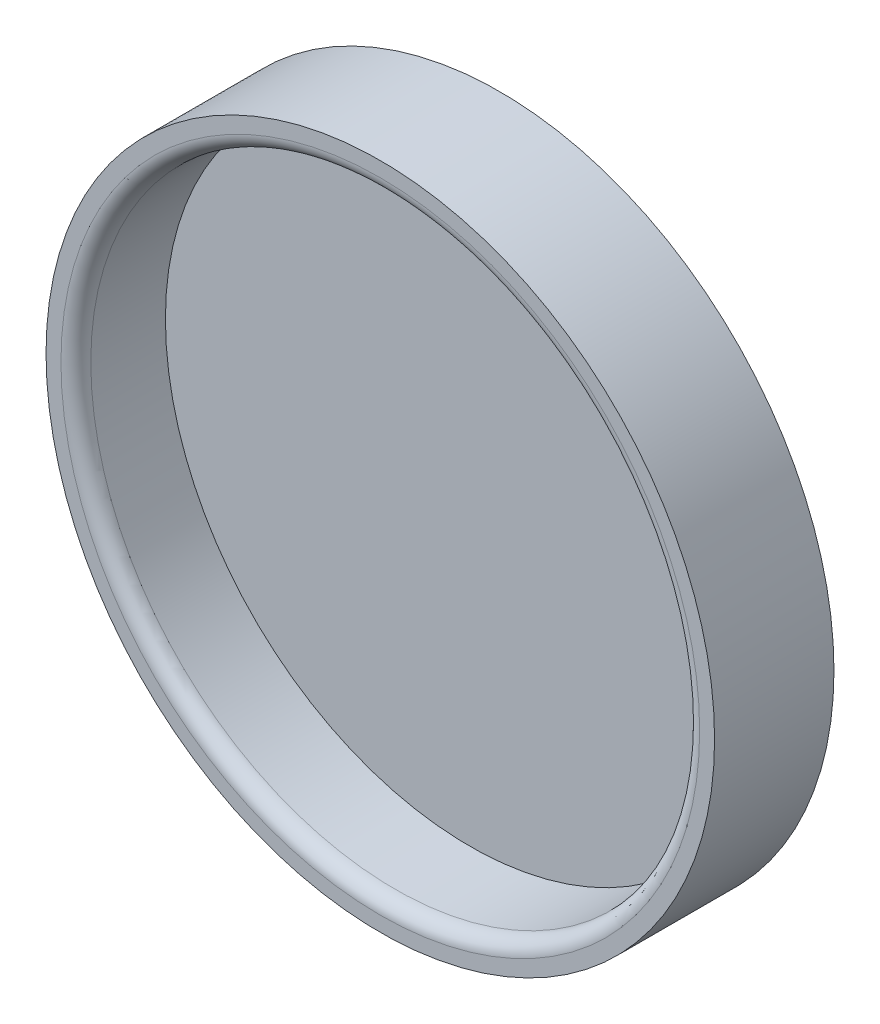
ISO-10303-21;
HEADER;
FILE_DESCRIPTION(('STEP AP214'),'2;1');
FILE_NAME('part.step','',(''),(''),'','','');
FILE_SCHEMA(('AUTOMOTIVE_DESIGN { 1 0 10303 214 1 1 1 1 }'));
ENDSEC;
DATA;
#1=APPLICATION_CONTEXT('core data for automotive mechanical design processes');
#2=APPLICATION_PROTOCOL_DEFINITION('international standard','automotive_design',2000,#1);
#3=PRODUCT_CONTEXT('',#1,'mechanical');
#4=PRODUCT('Part','Part','',(#3));
#5=PRODUCT_RELATED_PRODUCT_CATEGORY('part','',(#4));
#6=PRODUCT_DEFINITION_FORMATION('','',#4);
#7=PRODUCT_DEFINITION_CONTEXT('part definition',#1,'design');
#8=PRODUCT_DEFINITION('design','',#6,#7);
#9=PRODUCT_DEFINITION_SHAPE('','',#8);
#10=(LENGTH_UNIT() NAMED_UNIT(*) SI_UNIT(.MILLI.,.METRE.));
#11=(NAMED_UNIT(*) PLANE_ANGLE_UNIT() SI_UNIT($,.RADIAN.));
#12=(NAMED_UNIT(*) SI_UNIT($,.STERADIAN.) SOLID_ANGLE_UNIT());
#13=UNCERTAINTY_MEASURE_WITH_UNIT(LENGTH_MEASURE(1.E-05),#10,'distance_accuracy_value','');
#14=(GEOMETRIC_REPRESENTATION_CONTEXT(3) GLOBAL_UNCERTAINTY_ASSIGNED_CONTEXT((#13)) GLOBAL_UNIT_ASSIGNED_CONTEXT((#10,
#11,#12)) REPRESENTATION_CONTEXT('',''));
#15=CARTESIAN_POINT('',(0.,0.,0.));
#16=DIRECTION('',(0.,0.,1.));
#17=DIRECTION('',(1.,0.,0.));
#18=AXIS2_PLACEMENT_3D('',#15,#16,#17);
#19=CARTESIAN_POINT('',(0.,0.,1.));
#20=DIRECTION('',(0.,0.,-1.));
#21=DIRECTION('',(-1.,0.,0.));
#22=AXIS2_PLACEMENT_3D('',#19,#20,#21);
#23=CYLINDRICAL_SURFACE('',#22,11.2);
#24=CARTESIAN_POINT('',(0.,0.,0.));
#25=DIRECTION('',(0.,0.,1.));
#26=DIRECTION('',(1.,0.,0.));
#27=AXIS2_PLACEMENT_3D('',#24,#25,#26);
#28=CIRCLE('',#27,11.2);
#29=CARTESIAN_POINT('',(11.2,0.,0.));
#30=VERTEX_POINT('',#29);
#31=EDGE_CURVE('E56',#30,#30,#28,.T.);
#32=ORIENTED_EDGE('',*,*,#31,.T.);
#33=EDGE_LOOP('',(#32));
#34=FACE_BOUND('',#33,.T.);
#35=CARTESIAN_POINT('',(0.,0.,4.));
#36=DIRECTION('',(0.,0.,1.));
#37=DIRECTION('',(1.,0.,0.));
#38=AXIS2_PLACEMENT_3D('',#35,#36,#37);
#39=CIRCLE('',#38,11.2);
#40=CARTESIAN_POINT('',(11.2,0.,4.));
#41=VERTEX_POINT('',#40);
#42=EDGE_CURVE('E61',#41,#41,#39,.T.);
#43=ORIENTED_EDGE('',*,*,#42,.F.);
#44=EDGE_LOOP('',(#43));
#45=FACE_BOUND('',#44,.T.);
#46=ADVANCED_FACE('F41',(#34,#45),#23,.T.);
#47=CARTESIAN_POINT('',(0.,0.,0.));
#48=DIRECTION('',(0.,0.,1.));
#49=DIRECTION('',(1.,0.,0.));
#50=AXIS2_PLACEMENT_3D('',#47,#48,#49);
#51=PLANE('',#50);
#52=ORIENTED_EDGE('',*,*,#31,.F.);
#53=EDGE_LOOP('',(#52));
#54=FACE_BOUND('',#53,.T.);
#55=ADVANCED_FACE('F68',(#54),#51,.F.);
#56=CARTESIAN_POINT('',(0.,0.,4.));
#57=DIRECTION('',(0.,0.,1.));
#58=DIRECTION('',(1.,0.,0.));
#59=AXIS2_PLACEMENT_3D('',#56,#57,#58);
#60=PLANE('',#59);
#61=CARTESIAN_POINT('',(0.,0.,4.));
#62=DIRECTION('',(0.,0.,1.));
#63=DIRECTION('',(1.,0.,0.));
#64=AXIS2_PLACEMENT_3D('',#61,#62,#63);
#65=CIRCLE('',#64,10.7);
#66=CARTESIAN_POINT('',(10.7,0.,4.));
#67=VERTEX_POINT('',#66);
#68=EDGE_CURVE('E10',#67,#67,#65,.F.);
#69=ORIENTED_EDGE('',*,*,#68,.T.);
#70=EDGE_LOOP('',(#69));
#71=FACE_BOUND('',#70,.T.);
#72=ORIENTED_EDGE('',*,*,#42,.T.);
#73=EDGE_LOOP('',(#72));
#74=FACE_BOUND('',#73,.T.);
#75=ADVANCED_FACE('F65',(#71,#74),#60,.T.);
#76=CARTESIAN_POINT('',(0.,0.,4.));
#77=DIRECTION('',(0.,0.,-1.));
#78=DIRECTION('',(-1.,0.,0.));
#79=AXIS2_PLACEMENT_3D('',#76,#77,#78);
#80=CYLINDRICAL_SURFACE('',#79,10.2);
#81=CARTESIAN_POINT('',(0.,0.,3.5));
#82=DIRECTION('',(0.,0.,1.));
#83=DIRECTION('',(1.,0.,0.));
#84=AXIS2_PLACEMENT_3D('',#81,#82,#83);
#85=CIRCLE('',#84,10.2);
#86=CARTESIAN_POINT('',(10.2,0.,3.5));
#87=VERTEX_POINT('',#86);
#88=EDGE_CURVE('E48',#87,#87,#85,.T.);
#89=ORIENTED_EDGE('',*,*,#88,.T.);
#90=EDGE_LOOP('',(#89));
#91=FACE_BOUND('',#90,.T.);
#92=CARTESIAN_POINT('',(0.,0.,1.));
#93=DIRECTION('',(0.,0.,1.));
#94=DIRECTION('',(1.,0.,0.));
#95=AXIS2_PLACEMENT_3D('',#92,#93,#94);
#96=CIRCLE('',#95,10.2);
#97=CARTESIAN_POINT('',(10.2,0.,1.));
#98=VERTEX_POINT('',#97);
#99=EDGE_CURVE('E52',#98,#98,#96,.F.);
#100=ORIENTED_EDGE('',*,*,#99,.T.);
#101=EDGE_LOOP('',(#100));
#102=FACE_BOUND('',#101,.T.);
#103=ADVANCED_FACE('F79',(#91,#102),#80,.F.);
#104=CARTESIAN_POINT('',(0.,0.,1.));
#105=DIRECTION('',(0.,0.,1.));
#106=DIRECTION('',(1.,0.,0.));
#107=AXIS2_PLACEMENT_3D('',#104,#105,#106);
#108=PLANE('',#107);
#109=ORIENTED_EDGE('',*,*,#99,.F.);
#110=EDGE_LOOP('',(#109));
#111=FACE_BOUND('',#110,.T.);
#112=ADVANCED_FACE('F77',(#111),#108,.T.);
#113=CARTESIAN_POINT('',(0.,0.,3.5));
#114=DIRECTION('',(0.,0.,1.));
#115=DIRECTION('',(1.,0.,0.));
#116=AXIS2_PLACEMENT_3D('',#113,#114,#115);
#117=TOROIDAL_SURFACE('',#116,10.7,0.5);
#118=ORIENTED_EDGE('',*,*,#68,.F.);
#119=EDGE_LOOP('',(#118));
#120=FACE_BOUND('',#119,.T.);
#121=ORIENTED_EDGE('',*,*,#88,.F.);
#122=EDGE_LOOP('',(#121));
#123=FACE_BOUND('',#122,.T.);
#124=ADVANCED_FACE('F43',(#120,#123),#117,.T.);
#125=CLOSED_SHELL('',(#46,#55,#75,#103,#112,#124));
#126=MANIFOLD_SOLID_BREP('B2',#125);
#127=ADVANCED_BREP_SHAPE_REPRESENTATION('',(#18,#126),#14);
#128=SHAPE_DEFINITION_REPRESENTATION(#9,#127);
ENDSEC;
END-ISO-10303-21;
